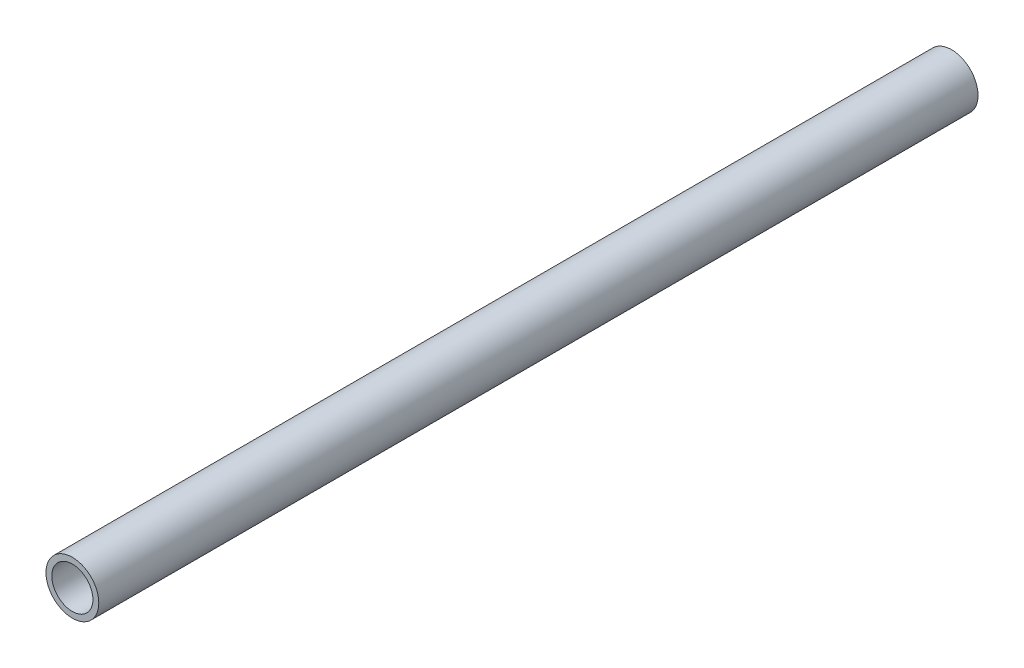
ISO-10303-21;
HEADER;
FILE_DESCRIPTION(('STEP AP214'),'2;1');
FILE_NAME('part.step','',(''),(''),'','','');
FILE_SCHEMA(('AUTOMOTIVE_DESIGN { 1 0 10303 214 1 1 1 1 }'));
ENDSEC;
DATA;
#1=APPLICATION_CONTEXT('core data for automotive mechanical design processes');
#2=APPLICATION_PROTOCOL_DEFINITION('international standard','automotive_design',2000,#1);
#3=PRODUCT_CONTEXT('',#1,'mechanical');
#4=PRODUCT('Part','Part','',(#3));
#5=PRODUCT_RELATED_PRODUCT_CATEGORY('part','',(#4));
#6=PRODUCT_DEFINITION_FORMATION('','',#4);
#7=PRODUCT_DEFINITION_CONTEXT('part definition',#1,'design');
#8=PRODUCT_DEFINITION('design','',#6,#7);
#9=PRODUCT_DEFINITION_SHAPE('','',#8);
#10=(LENGTH_UNIT() NAMED_UNIT(*) SI_UNIT(.MILLI.,.METRE.));
#11=(NAMED_UNIT(*) PLANE_ANGLE_UNIT() SI_UNIT($,.RADIAN.));
#12=(NAMED_UNIT(*) SI_UNIT($,.STERADIAN.) SOLID_ANGLE_UNIT());
#13=UNCERTAINTY_MEASURE_WITH_UNIT(LENGTH_MEASURE(1.E-05),#10,'distance_accuracy_value','');
#14=(GEOMETRIC_REPRESENTATION_CONTEXT(3) GLOBAL_UNCERTAINTY_ASSIGNED_CONTEXT((#13)) GLOBAL_UNIT_ASSIGNED_CONTEXT((#10,
#11,#12)) REPRESENTATION_CONTEXT('',''));
#15=CARTESIAN_POINT('',(0.,0.,0.));
#16=DIRECTION('',(0.,0.,1.));
#17=DIRECTION('',(1.,0.,0.));
#18=AXIS2_PLACEMENT_3D('',#15,#16,#17);
#19=CARTESIAN_POINT('',(0.,0.,299.527));
#20=DIRECTION('',(0.,0.,1.));
#21=DIRECTION('',(1.,0.,0.));
#22=AXIS2_PLACEMENT_3D('',#19,#20,#21);
#23=PLANE('',#22);
#24=CARTESIAN_POINT('',(0.,0.,299.527));
#25=DIRECTION('',(0.,0.,1.));
#26=DIRECTION('',(1.,0.,0.));
#27=AXIS2_PLACEMENT_3D('',#24,#25,#26);
#28=CIRCLE('',#27,9.);
#29=CARTESIAN_POINT('',(9.,0.,299.527));
#30=VERTEX_POINT('',#29);
#31=EDGE_CURVE('E10',#30,#30,#28,.T.);
#32=ORIENTED_EDGE('',*,*,#31,.T.);
#33=EDGE_LOOP('',(#32));
#34=FACE_BOUND('',#33,.T.);
#35=CARTESIAN_POINT('',(0.,0.,299.527));
#36=DIRECTION('',(0.,0.,1.));
#37=DIRECTION('',(1.,0.,0.));
#38=AXIS2_PLACEMENT_3D('',#35,#36,#37);
#39=CIRCLE('',#38,7.);
#40=CARTESIAN_POINT('',(7.,0.,299.527));
#41=VERTEX_POINT('',#40);
#42=EDGE_CURVE('E41',#41,#41,#39,.T.);
#43=ORIENTED_EDGE('',*,*,#42,.F.);
#44=EDGE_LOOP('',(#43));
#45=FACE_BOUND('',#44,.T.);
#46=ADVANCED_FACE('F30',(#34,#45),#23,.T.);
#47=CARTESIAN_POINT('',(0.,0.,0.));
#48=DIRECTION('',(0.,0.,1.));
#49=DIRECTION('',(1.,0.,0.));
#50=AXIS2_PLACEMENT_3D('',#47,#48,#49);
#51=PLANE('',#50);
#52=CARTESIAN_POINT('',(0.,0.,0.));
#53=DIRECTION('',(0.,0.,1.));
#54=DIRECTION('',(1.,0.,0.));
#55=AXIS2_PLACEMENT_3D('',#52,#53,#54);
#56=CIRCLE('',#55,9.);
#57=CARTESIAN_POINT('',(9.,0.,0.));
#58=VERTEX_POINT('',#57);
#59=EDGE_CURVE('E34',#58,#58,#56,.T.);
#60=ORIENTED_EDGE('',*,*,#59,.F.);
#61=EDGE_LOOP('',(#60));
#62=FACE_BOUND('',#61,.T.);
#63=CARTESIAN_POINT('',(0.,0.,0.));
#64=DIRECTION('',(0.,0.,1.));
#65=DIRECTION('',(1.,0.,0.));
#66=AXIS2_PLACEMENT_3D('',#63,#64,#65);
#67=CIRCLE('',#66,7.);
#68=CARTESIAN_POINT('',(7.,0.,0.));
#69=VERTEX_POINT('',#68);
#70=EDGE_CURVE('E43',#69,#69,#67,.T.);
#71=ORIENTED_EDGE('',*,*,#70,.T.);
#72=EDGE_LOOP('',(#71));
#73=FACE_BOUND('',#72,.T.);
#74=ADVANCED_FACE('F53',(#62,#73),#51,.F.);
#75=CARTESIAN_POINT('',(0.,0.,299.527));
#76=DIRECTION('',(0.,0.,-1.));
#77=DIRECTION('',(-1.,0.,0.));
#78=AXIS2_PLACEMENT_3D('',#75,#76,#77);
#79=CYLINDRICAL_SURFACE('',#78,9.);
#80=ORIENTED_EDGE('',*,*,#31,.F.);
#81=EDGE_LOOP('',(#80));
#82=FACE_BOUND('',#81,.T.);
#83=ORIENTED_EDGE('',*,*,#59,.T.);
#84=EDGE_LOOP('',(#83));
#85=FACE_BOUND('',#84,.T.);
#86=ADVANCED_FACE('F32',(#82,#85),#79,.T.);
#87=CARTESIAN_POINT('',(0.,0.,299.527));
#88=DIRECTION('',(0.,0.,-1.));
#89=DIRECTION('',(-1.,0.,0.));
#90=AXIS2_PLACEMENT_3D('',#87,#88,#89);
#91=CYLINDRICAL_SURFACE('',#90,7.);
#92=ORIENTED_EDGE('',*,*,#42,.T.);
#93=EDGE_LOOP('',(#92));
#94=FACE_BOUND('',#93,.T.);
#95=ORIENTED_EDGE('',*,*,#70,.F.);
#96=EDGE_LOOP('',(#95));
#97=FACE_BOUND('',#96,.T.);
#98=ADVANCED_FACE('F49',(#94,#97),#91,.F.);
#99=CLOSED_SHELL('',(#46,#74,#86,#98));
#100=MANIFOLD_SOLID_BREP('B2',#99);
#101=ADVANCED_BREP_SHAPE_REPRESENTATION('',(#18,#100),#14);
#102=SHAPE_DEFINITION_REPRESENTATION(#9,#101);
ENDSEC;
END-ISO-10303-21;
